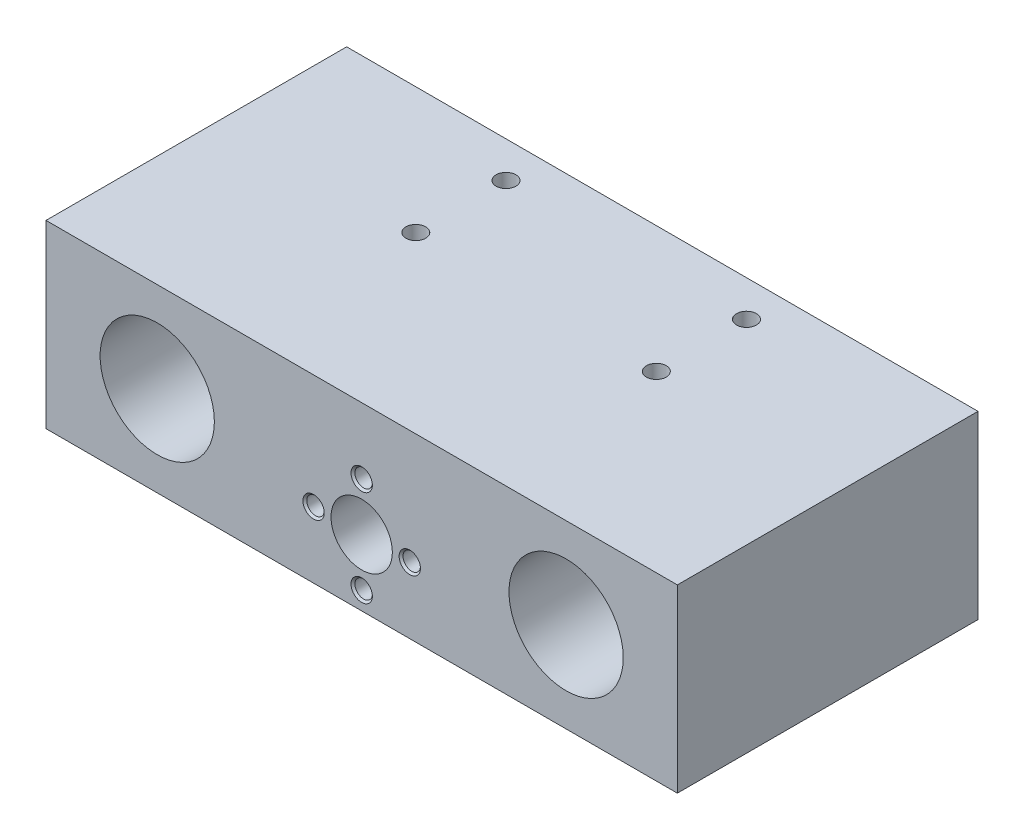
ISO-10303-21;
HEADER;
FILE_DESCRIPTION(('STEP AP214'),'2;1');
FILE_NAME('part.step','',(''),(''),'','','');
FILE_SCHEMA(('AUTOMOTIVE_DESIGN { 1 0 10303 214 1 1 1 1 }'));
ENDSEC;
DATA;
#1=APPLICATION_CONTEXT('core data for automotive mechanical design processes');
#2=APPLICATION_PROTOCOL_DEFINITION('international standard','automotive_design',2000,#1);
#3=PRODUCT_CONTEXT('',#1,'mechanical');
#4=PRODUCT('Part','Part','',(#3));
#5=PRODUCT_RELATED_PRODUCT_CATEGORY('part','',(#4));
#6=PRODUCT_DEFINITION_FORMATION('','',#4);
#7=PRODUCT_DEFINITION_CONTEXT('part definition',#1,'design');
#8=PRODUCT_DEFINITION('design','',#6,#7);
#9=PRODUCT_DEFINITION_SHAPE('','',#8);
#10=(LENGTH_UNIT() NAMED_UNIT(*) SI_UNIT(.MILLI.,.METRE.));
#11=(NAMED_UNIT(*) PLANE_ANGLE_UNIT() SI_UNIT($,.RADIAN.));
#12=(NAMED_UNIT(*) SI_UNIT($,.STERADIAN.) SOLID_ANGLE_UNIT());
#13=UNCERTAINTY_MEASURE_WITH_UNIT(LENGTH_MEASURE(1.E-05),#10,'distance_accuracy_value','');
#14=(GEOMETRIC_REPRESENTATION_CONTEXT(3) GLOBAL_UNCERTAINTY_ASSIGNED_CONTEXT((#13)) GLOBAL_UNIT_ASSIGNED_CONTEXT((#10,
#11,#12)) REPRESENTATION_CONTEXT('',''));
#15=CARTESIAN_POINT('',(0.,0.,0.));
#16=DIRECTION('',(0.,0.,1.));
#17=DIRECTION('',(1.,0.,0.));
#18=AXIS2_PLACEMENT_3D('',#15,#16,#17);
#19=CARTESIAN_POINT('',(0.,-4.,25.));
#20=DIRECTION('',(0.,0.,-1.));
#21=DIRECTION('',(-1.,0.,0.));
#22=AXIS2_PLACEMENT_3D('',#19,#20,#21);
#23=CYLINDRICAL_SURFACE('',#22,4.25);
#24=CARTESIAN_POINT('',(0.,-4.,-25.));
#25=DIRECTION('',(0.,0.,1.));
#26=DIRECTION('',(1.,0.,0.));
#27=AXIS2_PLACEMENT_3D('',#24,#25,#26);
#28=CIRCLE('',#27,4.25);
#29=CARTESIAN_POINT('',(4.25,-4.,-25.));
#30=VERTEX_POINT('',#29);
#31=EDGE_CURVE('E203',#30,#30,#28,.T.);
#32=ORIENTED_EDGE('',*,*,#31,.F.);
#33=EDGE_LOOP('',(#32));
#34=FACE_BOUND('',#33,.T.);
#35=CARTESIAN_POINT('',(0.,-4.,14.));
#36=DIRECTION('',(0.,0.,1.));
#37=DIRECTION('',(1.,0.,0.));
#38=AXIS2_PLACEMENT_3D('',#35,#36,#37);
#39=CIRCLE('',#38,4.25);
#40=CARTESIAN_POINT('',(4.25,-4.,14.));
#41=VERTEX_POINT('',#40);
#42=EDGE_CURVE('E59',#41,#41,#39,.T.);
#43=ORIENTED_EDGE('',*,*,#42,.T.);
#44=EDGE_LOOP('',(#43));
#45=FACE_BOUND('',#44,.T.);
#46=ADVANCED_FACE('F55',(#34,#45),#23,.F.);
#47=CARTESIAN_POINT('',(0.,0.,25.));
#48=DIRECTION('',(0.,0.,-1.));
#49=DIRECTION('',(-1.,0.,0.));
#50=AXIS2_PLACEMENT_3D('',#47,#48,#49);
#51=PLANE('',#50);
#52=CARTESIAN_POINT('',(-8.,-4.,25.));
#53=DIRECTION('',(0.,0.,1.));
#54=DIRECTION('',(1.,0.,0.));
#55=AXIS2_PLACEMENT_3D('',#52,#53,#54);
#56=CIRCLE('',#55,1.775);
#57=CARTESIAN_POINT('',(-6.225,-4.,25.));
#58=VERTEX_POINT('',#57);
#59=EDGE_CURVE('E146',#58,#58,#56,.T.);
#60=ORIENTED_EDGE('',*,*,#59,.F.);
#61=EDGE_LOOP('',(#60));
#62=FACE_BOUND('',#61,.T.);
#63=CARTESIAN_POINT('',(0.,4.,25.));
#64=DIRECTION('',(0.,0.,1.));
#65=DIRECTION('',(1.,0.,0.));
#66=AXIS2_PLACEMENT_3D('',#63,#64,#65);
#67=CIRCLE('',#66,1.775);
#68=CARTESIAN_POINT('',(1.77500000000003,4.,25.));
#69=VERTEX_POINT('',#68);
#70=EDGE_CURVE('E139',#69,#69,#67,.T.);
#71=ORIENTED_EDGE('',*,*,#70,.F.);
#72=EDGE_LOOP('',(#71));
#73=FACE_BOUND('',#72,.T.);
#74=CARTESIAN_POINT('',(8.,-4.00000000000005,25.));
#75=DIRECTION('',(0.,0.,1.));
#76=DIRECTION('',(1.,0.,0.));
#77=AXIS2_PLACEMENT_3D('',#74,#75,#76);
#78=CIRCLE('',#77,1.775);
#79=CARTESIAN_POINT('',(9.775,-4.00000000000005,25.));
#80=VERTEX_POINT('',#79);
#81=EDGE_CURVE('E155',#80,#80,#78,.T.);
#82=ORIENTED_EDGE('',*,*,#81,.F.);
#83=EDGE_LOOP('',(#82));
#84=FACE_BOUND('',#83,.T.);
#85=CARTESIAN_POINT('',(0.,-12.,25.));
#86=DIRECTION('',(0.,0.,1.));
#87=DIRECTION('',(1.,0.,0.));
#88=AXIS2_PLACEMENT_3D('',#85,#86,#87);
#89=CIRCLE('',#88,1.775);
#90=CARTESIAN_POINT('',(1.77499999999991,-12.,25.));
#91=VERTEX_POINT('',#90);
#92=EDGE_CURVE('E164',#91,#91,#89,.T.);
#93=ORIENTED_EDGE('',*,*,#92,.F.);
#94=EDGE_LOOP('',(#93));
#95=FACE_BOUND('',#94,.T.);
#96=CARTESIAN_POINT('',(0.,-4.,25.));
#97=DIRECTION('',(0.,0.,1.));
#98=DIRECTION('',(1.,0.,0.));
#99=AXIS2_PLACEMENT_3D('',#96,#97,#98);
#100=CIRCLE('',#99,5.1);
#101=CARTESIAN_POINT('',(5.1,-4.,25.));
#102=VERTEX_POINT('',#101);
#103=EDGE_CURVE('E173',#102,#102,#100,.T.);
#104=ORIENTED_EDGE('',*,*,#103,.F.);
#105=EDGE_LOOP('',(#104));
#106=FACE_BOUND('',#105,.T.);
#107=DIRECTION('',(0.,1.,0.));
#108=VECTOR('',#107,1.);
#109=CARTESIAN_POINT('',(52.5,-15.,25.));
#110=LINE('',#109,#108);
#111=CARTESIAN_POINT('',(52.5,-15.,25.));
#112=VERTEX_POINT('',#111);
#113=CARTESIAN_POINT('',(52.5,15.,25.));
#114=VERTEX_POINT('',#113);
#115=EDGE_CURVE('E219',#112,#114,#110,.T.);
#116=ORIENTED_EDGE('',*,*,#115,.T.);
#117=DIRECTION('',(-1.,0.,0.));
#118=VECTOR('',#117,1.);
#119=CARTESIAN_POINT('',(-52.5,15.,25.));
#120=LINE('',#119,#118);
#121=CARTESIAN_POINT('',(-52.5,15.,25.));
#122=VERTEX_POINT('',#121);
#123=EDGE_CURVE('E104',#114,#122,#120,.T.);
#124=ORIENTED_EDGE('',*,*,#123,.T.);
#125=DIRECTION('',(0.,-1.,0.));
#126=VECTOR('',#125,1.);
#127=CARTESIAN_POINT('',(-52.5,-15.,25.));
#128=LINE('',#127,#126);
#129=CARTESIAN_POINT('',(-52.5,-15.,25.));
#130=VERTEX_POINT('',#129);
#131=EDGE_CURVE('E222',#122,#130,#128,.T.);
#132=ORIENTED_EDGE('',*,*,#131,.T.);
#133=DIRECTION('',(1.,0.,0.));
#134=VECTOR('',#133,1.);
#135=CARTESIAN_POINT('',(-52.5,-15.,25.));
#136=LINE('',#135,#134);
#137=EDGE_CURVE('E73',#130,#112,#136,.T.);
#138=ORIENTED_EDGE('',*,*,#137,.T.);
#139=EDGE_LOOP('',(#116,#124,#132,#138));
#140=FACE_BOUND('',#139,.T.);
#141=CARTESIAN_POINT('',(-34.,0.,25.));
#142=DIRECTION('',(0.,0.,1.));
#143=DIRECTION('',(1.,0.,0.));
#144=AXIS2_PLACEMENT_3D('',#141,#142,#143);
#145=CIRCLE('',#144,9.5);
#146=CARTESIAN_POINT('',(-24.5,0.,25.));
#147=VERTEX_POINT('',#146);
#148=EDGE_CURVE('E213',#147,#147,#145,.T.);
#149=ORIENTED_EDGE('',*,*,#148,.F.);
#150=EDGE_LOOP('',(#149));
#151=FACE_BOUND('',#150,.T.);
#152=CARTESIAN_POINT('',(34.,0.,25.));
#153=DIRECTION('',(0.,0.,1.));
#154=DIRECTION('',(1.,0.,0.));
#155=AXIS2_PLACEMENT_3D('',#152,#153,#154);
#156=CIRCLE('',#155,9.5);
#157=CARTESIAN_POINT('',(43.5,0.,25.));
#158=VERTEX_POINT('',#157);
#159=EDGE_CURVE('E207',#158,#158,#156,.T.);
#160=ORIENTED_EDGE('',*,*,#159,.F.);
#161=EDGE_LOOP('',(#160));
#162=FACE_BOUND('',#161,.T.);
#163=ADVANCED_FACE('F259',(#62,#73,#84,#95,#106,#140,#151,#162),#51,.F.);
#164=CARTESIAN_POINT('',(0.,0.,-25.));
#165=DIRECTION('',(0.,0.,-1.));
#166=DIRECTION('',(-1.,0.,0.));
#167=AXIS2_PLACEMENT_3D('',#164,#165,#166);
#168=PLANE('',#167);
#169=CARTESIAN_POINT('',(34.,0.,-25.));
#170=DIRECTION('',(0.,0.,1.));
#171=DIRECTION('',(1.,0.,0.));
#172=AXIS2_PLACEMENT_3D('',#169,#170,#171);
#173=CIRCLE('',#172,9.5);
#174=CARTESIAN_POINT('',(43.5,0.,-25.));
#175=VERTEX_POINT('',#174);
#176=EDGE_CURVE('E206',#175,#175,#173,.T.);
#177=ORIENTED_EDGE('',*,*,#176,.T.);
#178=EDGE_LOOP('',(#177));
#179=FACE_BOUND('',#178,.T.);
#180=DIRECTION('',(0.,1.,0.));
#181=VECTOR('',#180,1.);
#182=CARTESIAN_POINT('',(52.5,-15.,-25.));
#183=LINE('',#182,#181);
#184=CARTESIAN_POINT('',(52.5,-15.,-25.));
#185=VERTEX_POINT('',#184);
#186=CARTESIAN_POINT('',(52.5,15.,-25.));
#187=VERTEX_POINT('',#186);
#188=EDGE_CURVE('E216',#185,#187,#183,.T.);
#189=ORIENTED_EDGE('',*,*,#188,.F.);
#190=DIRECTION('',(1.,0.,0.));
#191=VECTOR('',#190,1.);
#192=CARTESIAN_POINT('',(-52.5,-15.,-25.));
#193=LINE('',#192,#191);
#194=CARTESIAN_POINT('',(-52.5,-15.,-25.));
#195=VERTEX_POINT('',#194);
#196=EDGE_CURVE('E97',#195,#185,#193,.T.);
#197=ORIENTED_EDGE('',*,*,#196,.F.);
#198=DIRECTION('',(0.,-1.,0.));
#199=VECTOR('',#198,1.);
#200=CARTESIAN_POINT('',(-52.5,-15.,-25.));
#201=LINE('',#200,#199);
#202=CARTESIAN_POINT('',(-52.5,15.,-25.));
#203=VERTEX_POINT('',#202);
#204=EDGE_CURVE('E91',#203,#195,#201,.T.);
#205=ORIENTED_EDGE('',*,*,#204,.F.);
#206=DIRECTION('',(-1.,0.,0.));
#207=VECTOR('',#206,1.);
#208=CARTESIAN_POINT('',(-52.5,15.,-25.));
#209=LINE('',#208,#207);
#210=EDGE_CURVE('E228',#187,#203,#209,.T.);
#211=ORIENTED_EDGE('',*,*,#210,.F.);
#212=EDGE_LOOP('',(#189,#197,#205,#211));
#213=FACE_BOUND('',#212,.T.);
#214=CARTESIAN_POINT('',(-34.,0.,-25.));
#215=DIRECTION('',(0.,0.,1.));
#216=DIRECTION('',(1.,0.,0.));
#217=AXIS2_PLACEMENT_3D('',#214,#215,#216);
#218=CIRCLE('',#217,9.5);
#219=CARTESIAN_POINT('',(-24.5,0.,-25.));
#220=VERTEX_POINT('',#219);
#221=EDGE_CURVE('E210',#220,#220,#218,.T.);
#222=ORIENTED_EDGE('',*,*,#221,.T.);
#223=EDGE_LOOP('',(#222));
#224=FACE_BOUND('',#223,.T.);
#225=ORIENTED_EDGE('',*,*,#31,.T.);
#226=EDGE_LOOP('',(#225));
#227=FACE_BOUND('',#226,.T.);
#228=ADVANCED_FACE('F239',(#179,#213,#224,#227),#168,.T.);
#229=CARTESIAN_POINT('',(52.5,-15.,25.));
#230=DIRECTION('',(-1.,0.,0.));
#231=DIRECTION('',(0.,0.,1.));
#232=AXIS2_PLACEMENT_3D('',#229,#230,#231);
#233=PLANE('',#232);
#234=ORIENTED_EDGE('',*,*,#188,.T.);
#235=DIRECTION('',(0.,0.,-1.));
#236=VECTOR('',#235,1.);
#237=CARTESIAN_POINT('',(52.5,15.,25.));
#238=LINE('',#237,#236);
#239=EDGE_CURVE('E13',#114,#187,#238,.T.);
#240=ORIENTED_EDGE('',*,*,#239,.F.);
#241=ORIENTED_EDGE('',*,*,#115,.F.);
#242=DIRECTION('',(0.,0.,-1.));
#243=VECTOR('',#242,1.);
#244=CARTESIAN_POINT('',(52.5,-15.,25.));
#245=LINE('',#244,#243);
#246=EDGE_CURVE('E225',#112,#185,#245,.T.);
#247=ORIENTED_EDGE('',*,*,#246,.T.);
#248=EDGE_LOOP('',(#234,#240,#241,#247));
#249=FACE_BOUND('',#248,.T.);
#250=ADVANCED_FACE('F57',(#249),#233,.F.);
#251=CARTESIAN_POINT('',(-52.5,15.,25.));
#252=DIRECTION('',(0.,-1.,0.));
#253=DIRECTION('',(0.,0.,-1.));
#254=AXIS2_PLACEMENT_3D('',#251,#252,#253);
#255=PLANE('',#254);
#256=CARTESIAN_POINT('',(20.,15.,-19.));
#257=DIRECTION('',(0.,1.,0.));
#258=DIRECTION('',(0.,0.,1.));
#259=AXIS2_PLACEMENT_3D('',#256,#257,#258);
#260=CIRCLE('',#259,1.64999999999999);
#261=CARTESIAN_POINT('',(20.,15.,-17.35));
#262=VERTEX_POINT('',#261);
#263=EDGE_CURVE('E179',#262,#262,#260,.T.);
#264=ORIENTED_EDGE('',*,*,#263,.F.);
#265=EDGE_LOOP('',(#264));
#266=FACE_BOUND('',#265,.T.);
#267=CARTESIAN_POINT('',(20.,15.,-4.));
#268=DIRECTION('',(0.,1.,0.));
#269=DIRECTION('',(0.,0.,1.));
#270=AXIS2_PLACEMENT_3D('',#267,#268,#269);
#271=CIRCLE('',#270,1.64999999999999);
#272=CARTESIAN_POINT('',(20.,15.,-2.35000000000002));
#273=VERTEX_POINT('',#272);
#274=EDGE_CURVE('E185',#273,#273,#271,.T.);
#275=ORIENTED_EDGE('',*,*,#274,.F.);
#276=EDGE_LOOP('',(#275));
#277=FACE_BOUND('',#276,.T.);
#278=CARTESIAN_POINT('',(-20.,15.,-4.));
#279=DIRECTION('',(0.,1.,0.));
#280=DIRECTION('',(0.,0.,1.));
#281=AXIS2_PLACEMENT_3D('',#278,#279,#280);
#282=CIRCLE('',#281,1.64999999999999);
#283=CARTESIAN_POINT('',(-20.,15.,-2.35000000000002));
#284=VERTEX_POINT('',#283);
#285=EDGE_CURVE('E191',#284,#284,#282,.T.);
#286=ORIENTED_EDGE('',*,*,#285,.F.);
#287=EDGE_LOOP('',(#286));
#288=FACE_BOUND('',#287,.T.);
#289=CARTESIAN_POINT('',(-20.,15.,-19.));
#290=DIRECTION('',(0.,1.,0.));
#291=DIRECTION('',(0.,0.,1.));
#292=AXIS2_PLACEMENT_3D('',#289,#290,#291);
#293=CIRCLE('',#292,1.64999999999999);
#294=CARTESIAN_POINT('',(-20.,15.,-17.35));
#295=VERTEX_POINT('',#294);
#296=EDGE_CURVE('E197',#295,#295,#293,.T.);
#297=ORIENTED_EDGE('',*,*,#296,.F.);
#298=EDGE_LOOP('',(#297));
#299=FACE_BOUND('',#298,.T.);
#300=ORIENTED_EDGE('',*,*,#210,.T.);
#301=DIRECTION('',(0.,0.,-1.));
#302=VECTOR('',#301,1.);
#303=CARTESIAN_POINT('',(-52.5,15.,25.));
#304=LINE('',#303,#302);
#305=EDGE_CURVE('E65',#122,#203,#304,.T.);
#306=ORIENTED_EDGE('',*,*,#305,.F.);
#307=ORIENTED_EDGE('',*,*,#123,.F.);
#308=ORIENTED_EDGE('',*,*,#239,.T.);
#309=EDGE_LOOP('',(#300,#306,#307,#308));
#310=FACE_BOUND('',#309,.T.);
#311=ADVANCED_FACE('F255',(#266,#277,#288,#299,#310),#255,.F.);
#312=CARTESIAN_POINT('',(-52.5,-15.,25.));
#313=DIRECTION('',(1.,0.,0.));
#314=DIRECTION('',(0.,0.,-1.));
#315=AXIS2_PLACEMENT_3D('',#312,#313,#314);
#316=PLANE('',#315);
#317=ORIENTED_EDGE('',*,*,#204,.T.);
#318=DIRECTION('',(0.,0.,-1.));
#319=VECTOR('',#318,1.);
#320=CARTESIAN_POINT('',(-52.5,-15.,25.));
#321=LINE('',#320,#319);
#322=EDGE_CURVE('E233',#130,#195,#321,.T.);
#323=ORIENTED_EDGE('',*,*,#322,.F.);
#324=ORIENTED_EDGE('',*,*,#131,.F.);
#325=ORIENTED_EDGE('',*,*,#305,.T.);
#326=EDGE_LOOP('',(#317,#323,#324,#325));
#327=FACE_BOUND('',#326,.T.);
#328=ADVANCED_FACE('F236',(#327),#316,.F.);
#329=CARTESIAN_POINT('',(-52.5,-15.,25.));
#330=DIRECTION('',(0.,1.,0.));
#331=DIRECTION('',(0.,0.,1.));
#332=AXIS2_PLACEMENT_3D('',#329,#330,#331);
#333=PLANE('',#332);
#334=ORIENTED_EDGE('',*,*,#196,.T.);
#335=ORIENTED_EDGE('',*,*,#246,.F.);
#336=ORIENTED_EDGE('',*,*,#137,.F.);
#337=ORIENTED_EDGE('',*,*,#322,.T.);
#338=EDGE_LOOP('',(#334,#335,#336,#337));
#339=FACE_BOUND('',#338,.T.);
#340=ADVANCED_FACE('F244',(#339),#333,.F.);
#341=CARTESIAN_POINT('',(-34.,0.,25.));
#342=DIRECTION('',(0.,0.,-1.));
#343=DIRECTION('',(-1.,0.,0.));
#344=AXIS2_PLACEMENT_3D('',#341,#342,#343);
#345=CYLINDRICAL_SURFACE('',#344,9.5);
#346=ORIENTED_EDGE('',*,*,#148,.T.);
#347=EDGE_LOOP('',(#346));
#348=FACE_BOUND('',#347,.T.);
#349=ORIENTED_EDGE('',*,*,#221,.F.);
#350=EDGE_LOOP('',(#349));
#351=FACE_BOUND('',#350,.T.);
#352=ADVANCED_FACE('F246',(#348,#351),#345,.F.);
#353=CARTESIAN_POINT('',(34.,0.,25.));
#354=DIRECTION('',(0.,0.,-1.));
#355=DIRECTION('',(-1.,0.,0.));
#356=AXIS2_PLACEMENT_3D('',#353,#354,#355);
#357=CYLINDRICAL_SURFACE('',#356,9.5);
#358=ORIENTED_EDGE('',*,*,#159,.T.);
#359=EDGE_LOOP('',(#358));
#360=FACE_BOUND('',#359,.T.);
#361=ORIENTED_EDGE('',*,*,#176,.F.);
#362=EDGE_LOOP('',(#361));
#363=FACE_BOUND('',#362,.T.);
#364=ADVANCED_FACE('F252',(#360,#363),#357,.F.);
#365=CARTESIAN_POINT('',(-20.,3.5,-19.));
#366=DIRECTION('',(0.,1.,0.));
#367=DIRECTION('',(0.,0.,1.));
#368=AXIS2_PLACEMENT_3D('',#365,#366,#367);
#369=CONICAL_SURFACE('',#368,1.65,1.02974425867665);
#370=CARTESIAN_POINT('',(-20.,2.50857997860453,-19.));
#371=VERTEX_POINT('',#370);
#372=VERTEX_LOOP('',#371);
#373=FACE_BOUND('',#372,.T.);
#374=CARTESIAN_POINT('',(-20.,3.5,-19.));
#375=DIRECTION('',(0.,1.,0.));
#376=DIRECTION('',(0.,0.,1.));
#377=AXIS2_PLACEMENT_3D('',#374,#375,#376);
#378=CIRCLE('',#377,1.65);
#379=CARTESIAN_POINT('',(-20.,3.5,-17.35));
#380=VERTEX_POINT('',#379);
#381=EDGE_CURVE('E200',#380,#380,#378,.T.);
#382=ORIENTED_EDGE('',*,*,#381,.T.);
#383=EDGE_LOOP('',(#382));
#384=FACE_BOUND('',#383,.T.);
#385=ADVANCED_FACE('F271',(#373,#384),#369,.F.);
#386=CARTESIAN_POINT('',(-20.,15.,-19.));
#387=DIRECTION('',(0.,1.,0.));
#388=DIRECTION('',(0.,0.,1.));
#389=AXIS2_PLACEMENT_3D('',#386,#387,#388);
#390=CYLINDRICAL_SURFACE('',#389,1.64999999999999);
#391=ORIENTED_EDGE('',*,*,#381,.F.);
#392=EDGE_LOOP('',(#391));
#393=FACE_BOUND('',#392,.T.);
#394=ORIENTED_EDGE('',*,*,#296,.T.);
#395=EDGE_LOOP('',(#394));
#396=FACE_BOUND('',#395,.T.);
#397=ADVANCED_FACE('F296',(#393,#396),#390,.F.);
#398=CARTESIAN_POINT('',(-20.,3.5,-4.));
#399=DIRECTION('',(0.,1.,0.));
#400=DIRECTION('',(0.,0.,1.));
#401=AXIS2_PLACEMENT_3D('',#398,#399,#400);
#402=CONICAL_SURFACE('',#401,1.65,1.02974425867665);
#403=CARTESIAN_POINT('',(-20.,2.50857997860453,-4.));
#404=VERTEX_POINT('',#403);
#405=VERTEX_LOOP('',#404);
#406=FACE_BOUND('',#405,.T.);
#407=CARTESIAN_POINT('',(-20.,3.5,-4.));
#408=DIRECTION('',(0.,1.,0.));
#409=DIRECTION('',(0.,0.,1.));
#410=AXIS2_PLACEMENT_3D('',#407,#408,#409);
#411=CIRCLE('',#410,1.65);
#412=CARTESIAN_POINT('',(-20.,3.5,-2.35));
#413=VERTEX_POINT('',#412);
#414=EDGE_CURVE('E194',#413,#413,#411,.T.);
#415=ORIENTED_EDGE('',*,*,#414,.T.);
#416=EDGE_LOOP('',(#415));
#417=FACE_BOUND('',#416,.T.);
#418=ADVANCED_FACE('F298',(#406,#417),#402,.F.);
#419=CARTESIAN_POINT('',(-20.,15.,-4.));
#420=DIRECTION('',(0.,1.,0.));
#421=DIRECTION('',(0.,0.,1.));
#422=AXIS2_PLACEMENT_3D('',#419,#420,#421);
#423=CYLINDRICAL_SURFACE('',#422,1.64999999999999);
#424=ORIENTED_EDGE('',*,*,#414,.F.);
#425=EDGE_LOOP('',(#424));
#426=FACE_BOUND('',#425,.T.);
#427=ORIENTED_EDGE('',*,*,#285,.T.);
#428=EDGE_LOOP('',(#427));
#429=FACE_BOUND('',#428,.T.);
#430=ADVANCED_FACE('F304',(#426,#429),#423,.F.);
#431=CARTESIAN_POINT('',(20.,3.5,-4.));
#432=DIRECTION('',(0.,1.,0.));
#433=DIRECTION('',(0.,0.,1.));
#434=AXIS2_PLACEMENT_3D('',#431,#432,#433);
#435=CONICAL_SURFACE('',#434,1.65,1.02974425867665);
#436=CARTESIAN_POINT('',(20.,2.50857997860453,-4.));
#437=VERTEX_POINT('',#436);
#438=VERTEX_LOOP('',#437);
#439=FACE_BOUND('',#438,.T.);
#440=CARTESIAN_POINT('',(20.,3.5,-4.));
#441=DIRECTION('',(0.,1.,0.));
#442=DIRECTION('',(0.,0.,1.));
#443=AXIS2_PLACEMENT_3D('',#440,#441,#442);
#444=CIRCLE('',#443,1.65);
#445=CARTESIAN_POINT('',(20.,3.5,-2.35));
#446=VERTEX_POINT('',#445);
#447=EDGE_CURVE('E188',#446,#446,#444,.T.);
#448=ORIENTED_EDGE('',*,*,#447,.T.);
#449=EDGE_LOOP('',(#448));
#450=FACE_BOUND('',#449,.T.);
#451=ADVANCED_FACE('F312',(#439,#450),#435,.F.);
#452=CARTESIAN_POINT('',(20.,15.,-4.));
#453=DIRECTION('',(0.,1.,0.));
#454=DIRECTION('',(0.,0.,1.));
#455=AXIS2_PLACEMENT_3D('',#452,#453,#454);
#456=CYLINDRICAL_SURFACE('',#455,1.64999999999999);
#457=ORIENTED_EDGE('',*,*,#447,.F.);
#458=EDGE_LOOP('',(#457));
#459=FACE_BOUND('',#458,.T.);
#460=ORIENTED_EDGE('',*,*,#274,.T.);
#461=EDGE_LOOP('',(#460));
#462=FACE_BOUND('',#461,.T.);
#463=ADVANCED_FACE('F316',(#459,#462),#456,.F.);
#464=CARTESIAN_POINT('',(20.,3.5,-19.));
#465=DIRECTION('',(0.,1.,0.));
#466=DIRECTION('',(0.,0.,1.));
#467=AXIS2_PLACEMENT_3D('',#464,#465,#466);
#468=CONICAL_SURFACE('',#467,1.65,1.02974425867665);
#469=CARTESIAN_POINT('',(20.,2.50857997860453,-19.));
#470=VERTEX_POINT('',#469);
#471=VERTEX_LOOP('',#470);
#472=FACE_BOUND('',#471,.T.);
#473=CARTESIAN_POINT('',(20.,3.5,-19.));
#474=DIRECTION('',(0.,1.,0.));
#475=DIRECTION('',(0.,0.,1.));
#476=AXIS2_PLACEMENT_3D('',#473,#474,#475);
#477=CIRCLE('',#476,1.65);
#478=CARTESIAN_POINT('',(20.,3.5,-17.35));
#479=VERTEX_POINT('',#478);
#480=EDGE_CURVE('E182',#479,#479,#477,.T.);
#481=ORIENTED_EDGE('',*,*,#480,.T.);
#482=EDGE_LOOP('',(#481));
#483=FACE_BOUND('',#482,.T.);
#484=ADVANCED_FACE('F320',(#472,#483),#468,.F.);
#485=CARTESIAN_POINT('',(20.,15.,-19.));
#486=DIRECTION('',(0.,1.,0.));
#487=DIRECTION('',(0.,0.,1.));
#488=AXIS2_PLACEMENT_3D('',#485,#486,#487);
#489=CYLINDRICAL_SURFACE('',#488,1.64999999999999);
#490=ORIENTED_EDGE('',*,*,#480,.F.);
#491=EDGE_LOOP('',(#490));
#492=FACE_BOUND('',#491,.T.);
#493=ORIENTED_EDGE('',*,*,#263,.T.);
#494=EDGE_LOOP('',(#493));
#495=FACE_BOUND('',#494,.T.);
#496=ADVANCED_FACE('F324',(#492,#495),#489,.F.);
#497=CARTESIAN_POINT('',(0.,-4.,14.));
#498=DIRECTION('',(0.,0.,1.));
#499=DIRECTION('',(1.,0.,0.));
#500=AXIS2_PLACEMENT_3D('',#497,#498,#499);
#501=CYLINDRICAL_SURFACE('',#500,5.1);
#502=CARTESIAN_POINT('',(0.,-4.,14.));
#503=DIRECTION('',(0.,0.,1.));
#504=DIRECTION('',(1.,0.,0.));
#505=AXIS2_PLACEMENT_3D('',#502,#503,#504);
#506=CIRCLE('',#505,5.1);
#507=CARTESIAN_POINT('',(5.1,-4.,14.));
#508=VERTEX_POINT('',#507);
#509=EDGE_CURVE('E174',#508,#508,#506,.T.);
#510=ORIENTED_EDGE('',*,*,#509,.F.);
#511=EDGE_LOOP('',(#510));
#512=FACE_BOUND('',#511,.T.);
#513=ORIENTED_EDGE('',*,*,#103,.T.);
#514=EDGE_LOOP('',(#513));
#515=FACE_BOUND('',#514,.T.);
#516=ADVANCED_FACE('F328',(#512,#515),#501,.F.);
#517=CARTESIAN_POINT('',(0.,-4.,14.));
#518=DIRECTION('',(0.,0.,1.));
#519=DIRECTION('',(1.,0.,0.));
#520=AXIS2_PLACEMENT_3D('',#517,#518,#519);
#521=PLANE('',#520);
#522=ORIENTED_EDGE('',*,*,#42,.F.);
#523=EDGE_LOOP('',(#522));
#524=FACE_BOUND('',#523,.T.);
#525=ORIENTED_EDGE('',*,*,#509,.T.);
#526=EDGE_LOOP('',(#525));
#527=FACE_BOUND('',#526,.T.);
#528=ADVANCED_FACE('F332',(#524,#527),#521,.T.);
#529=CARTESIAN_POINT('',(0.,-12.,10.));
#530=DIRECTION('',(0.,0.,1.));
#531=DIRECTION('',(1.,0.,0.));
#532=AXIS2_PLACEMENT_3D('',#529,#530,#531);
#533=CONICAL_SURFACE('',#532,1.44999999999999,1.02974425867665);
#534=CARTESIAN_POINT('',(0.,-12.,9.12875210241004));
#535=VERTEX_POINT('',#534);
#536=VERTEX_LOOP('',#535);
#537=FACE_BOUND('',#536,.T.);
#538=CARTESIAN_POINT('',(0.,-12.,10.));
#539=DIRECTION('',(0.,0.,1.));
#540=DIRECTION('',(1.,0.,0.));
#541=AXIS2_PLACEMENT_3D('',#538,#539,#540);
#542=CIRCLE('',#541,1.44999999999999);
#543=CARTESIAN_POINT('',(1.4499999999999,-12.,10.));
#544=VERTEX_POINT('',#543);
#545=EDGE_CURVE('E170',#544,#544,#542,.T.);
#546=ORIENTED_EDGE('',*,*,#545,.T.);
#547=EDGE_LOOP('',(#546));
#548=FACE_BOUND('',#547,.T.);
#549=ADVANCED_FACE('F336',(#537,#548),#533,.F.);
#550=CARTESIAN_POINT('',(0.,-12.,25.));
#551=DIRECTION('',(0.,0.,1.));
#552=DIRECTION('',(1.,0.,0.));
#553=AXIS2_PLACEMENT_3D('',#550,#551,#552);
#554=CYLINDRICAL_SURFACE('',#553,1.44999999999999);
#555=ORIENTED_EDGE('',*,*,#545,.F.);
#556=EDGE_LOOP('',(#555));
#557=FACE_BOUND('',#556,.T.);
#558=CARTESIAN_POINT('',(0.,-12.,24.675));
#559=DIRECTION('',(0.,0.,1.));
#560=DIRECTION('',(1.,0.,0.));
#561=AXIS2_PLACEMENT_3D('',#558,#559,#560);
#562=CIRCLE('',#561,1.44999999999999);
#563=CARTESIAN_POINT('',(1.4499999999999,-12.,24.675));
#564=VERTEX_POINT('',#563);
#565=EDGE_CURVE('E167',#564,#564,#562,.T.);
#566=ORIENTED_EDGE('',*,*,#565,.T.);
#567=EDGE_LOOP('',(#566));
#568=FACE_BOUND('',#567,.T.);
#569=ADVANCED_FACE('F340',(#557,#568),#554,.F.);
#570=CARTESIAN_POINT('',(0.,-12.,25.));
#571=DIRECTION('',(0.,0.,1.));
#572=DIRECTION('',(1.,0.,0.));
#573=AXIS2_PLACEMENT_3D('',#570,#571,#572);
#574=CONICAL_SURFACE('',#573,1.775,0.785398163397451);
#575=ORIENTED_EDGE('',*,*,#565,.F.);
#576=EDGE_LOOP('',(#575));
#577=FACE_BOUND('',#576,.T.);
#578=ORIENTED_EDGE('',*,*,#92,.T.);
#579=EDGE_LOOP('',(#578));
#580=FACE_BOUND('',#579,.T.);
#581=ADVANCED_FACE('F344',(#577,#580),#574,.F.);
#582=CARTESIAN_POINT('',(8.,-4.00000000000005,10.));
#583=DIRECTION('',(0.,0.,1.));
#584=DIRECTION('',(1.,0.,0.));
#585=AXIS2_PLACEMENT_3D('',#582,#583,#584);
#586=CONICAL_SURFACE('',#585,1.44999999999999,1.02974425867665);
#587=CARTESIAN_POINT('',(8.,-4.00000000000005,9.12875210241004));
#588=VERTEX_POINT('',#587);
#589=VERTEX_LOOP('',#588);
#590=FACE_BOUND('',#589,.T.);
#591=CARTESIAN_POINT('',(8.,-4.00000000000005,10.));
#592=DIRECTION('',(0.,0.,1.));
#593=DIRECTION('',(1.,0.,0.));
#594=AXIS2_PLACEMENT_3D('',#591,#592,#593);
#595=CIRCLE('',#594,1.44999999999999);
#596=CARTESIAN_POINT('',(9.44999999999999,-4.00000000000005,10.));
#597=VERTEX_POINT('',#596);
#598=EDGE_CURVE('E161',#597,#597,#595,.T.);
#599=ORIENTED_EDGE('',*,*,#598,.T.);
#600=EDGE_LOOP('',(#599));
#601=FACE_BOUND('',#600,.T.);
#602=ADVANCED_FACE('F348',(#590,#601),#586,.F.);
#603=CARTESIAN_POINT('',(8.,-4.00000000000005,25.));
#604=DIRECTION('',(0.,0.,1.));
#605=DIRECTION('',(1.,0.,0.));
#606=AXIS2_PLACEMENT_3D('',#603,#604,#605);
#607=CYLINDRICAL_SURFACE('',#606,1.44999999999999);
#608=ORIENTED_EDGE('',*,*,#598,.F.);
#609=EDGE_LOOP('',(#608));
#610=FACE_BOUND('',#609,.T.);
#611=CARTESIAN_POINT('',(8.,-4.00000000000005,24.675));
#612=DIRECTION('',(0.,0.,1.));
#613=DIRECTION('',(1.,0.,0.));
#614=AXIS2_PLACEMENT_3D('',#611,#612,#613);
#615=CIRCLE('',#614,1.44999999999999);
#616=CARTESIAN_POINT('',(9.44999999999999,-4.00000000000005,24.675));
#617=VERTEX_POINT('',#616);
#618=EDGE_CURVE('E158',#617,#617,#615,.T.);
#619=ORIENTED_EDGE('',*,*,#618,.T.);
#620=EDGE_LOOP('',(#619));
#621=FACE_BOUND('',#620,.T.);
#622=ADVANCED_FACE('F352',(#610,#621),#607,.F.);
#623=CARTESIAN_POINT('',(8.,-4.00000000000005,25.));
#624=DIRECTION('',(0.,0.,1.));
#625=DIRECTION('',(1.,0.,0.));
#626=AXIS2_PLACEMENT_3D('',#623,#624,#625);
#627=CONICAL_SURFACE('',#626,1.775,0.785398163397451);
#628=ORIENTED_EDGE('',*,*,#618,.F.);
#629=EDGE_LOOP('',(#628));
#630=FACE_BOUND('',#629,.T.);
#631=ORIENTED_EDGE('',*,*,#81,.T.);
#632=EDGE_LOOP('',(#631));
#633=FACE_BOUND('',#632,.T.);
#634=ADVANCED_FACE('F356',(#630,#633),#627,.F.);
#635=CARTESIAN_POINT('',(0.,4.,10.));
#636=DIRECTION('',(0.,0.,1.));
#637=DIRECTION('',(1.,0.,0.));
#638=AXIS2_PLACEMENT_3D('',#635,#636,#637);
#639=CONICAL_SURFACE('',#638,1.44999999999999,1.02974425867665);
#640=CARTESIAN_POINT('',(0.,4.,9.12875210241004));
#641=VERTEX_POINT('',#640);
#642=VERTEX_LOOP('',#641);
#643=FACE_BOUND('',#642,.T.);
#644=CARTESIAN_POINT('',(0.,4.,10.));
#645=DIRECTION('',(0.,0.,1.));
#646=DIRECTION('',(1.,0.,0.));
#647=AXIS2_PLACEMENT_3D('',#644,#645,#646);
#648=CIRCLE('',#647,1.44999999999999);
#649=CARTESIAN_POINT('',(1.45000000000002,4.,10.));
#650=VERTEX_POINT('',#649);
#651=EDGE_CURVE('E152',#650,#650,#648,.T.);
#652=ORIENTED_EDGE('',*,*,#651,.T.);
#653=EDGE_LOOP('',(#652));
#654=FACE_BOUND('',#653,.T.);
#655=ADVANCED_FACE('F360',(#643,#654),#639,.F.);
#656=CARTESIAN_POINT('',(0.,4.,25.));
#657=DIRECTION('',(0.,0.,1.));
#658=DIRECTION('',(1.,0.,0.));
#659=AXIS2_PLACEMENT_3D('',#656,#657,#658);
#660=CYLINDRICAL_SURFACE('',#659,1.44999999999999);
#661=ORIENTED_EDGE('',*,*,#651,.F.);
#662=EDGE_LOOP('',(#661));
#663=FACE_BOUND('',#662,.T.);
#664=CARTESIAN_POINT('',(0.,4.,24.675));
#665=DIRECTION('',(0.,0.,1.));
#666=DIRECTION('',(1.,0.,0.));
#667=AXIS2_PLACEMENT_3D('',#664,#665,#666);
#668=CIRCLE('',#667,1.44999999999999);
#669=CARTESIAN_POINT('',(1.45000000000002,4.,24.675));
#670=VERTEX_POINT('',#669);
#671=EDGE_CURVE('E143',#670,#670,#668,.T.);
#672=ORIENTED_EDGE('',*,*,#671,.T.);
#673=EDGE_LOOP('',(#672));
#674=FACE_BOUND('',#673,.T.);
#675=ADVANCED_FACE('F364',(#663,#674),#660,.F.);
#676=CARTESIAN_POINT('',(0.,4.,25.));
#677=DIRECTION('',(0.,0.,1.));
#678=DIRECTION('',(1.,0.,0.));
#679=AXIS2_PLACEMENT_3D('',#676,#677,#678);
#680=CONICAL_SURFACE('',#679,1.775,0.785398163397451);
#681=ORIENTED_EDGE('',*,*,#671,.F.);
#682=EDGE_LOOP('',(#681));
#683=FACE_BOUND('',#682,.T.);
#684=ORIENTED_EDGE('',*,*,#70,.T.);
#685=EDGE_LOOP('',(#684));
#686=FACE_BOUND('',#685,.T.);
#687=ADVANCED_FACE('F133',(#683,#686),#680,.F.);
#688=CARTESIAN_POINT('',(-8.,-4.,10.));
#689=DIRECTION('',(0.,0.,1.));
#690=DIRECTION('',(1.,0.,0.));
#691=AXIS2_PLACEMENT_3D('',#688,#689,#690);
#692=CONICAL_SURFACE('',#691,1.44999999999999,1.02974425867665);
#693=CARTESIAN_POINT('',(-8.,-4.,9.12875210241004));
#694=VERTEX_POINT('',#693);
#695=VERTEX_LOOP('',#694);
#696=FACE_BOUND('',#695,.T.);
#697=CARTESIAN_POINT('',(-8.,-4.,10.));
#698=DIRECTION('',(0.,0.,1.));
#699=DIRECTION('',(1.,0.,0.));
#700=AXIS2_PLACEMENT_3D('',#697,#698,#699);
#701=CIRCLE('',#700,1.44999999999999);
#702=CARTESIAN_POINT('',(-6.55000000000001,-4.,10.));
#703=VERTEX_POINT('',#702);
#704=EDGE_CURVE('E137',#703,#703,#701,.T.);
#705=ORIENTED_EDGE('',*,*,#704,.T.);
#706=EDGE_LOOP('',(#705));
#707=FACE_BOUND('',#706,.T.);
#708=ADVANCED_FACE('F129',(#696,#707),#692,.F.);
#709=CARTESIAN_POINT('',(-8.,-4.,25.));
#710=DIRECTION('',(0.,0.,1.));
#711=DIRECTION('',(1.,0.,0.));
#712=AXIS2_PLACEMENT_3D('',#709,#710,#711);
#713=CYLINDRICAL_SURFACE('',#712,1.44999999999999);
#714=ORIENTED_EDGE('',*,*,#704,.F.);
#715=EDGE_LOOP('',(#714));
#716=FACE_BOUND('',#715,.T.);
#717=CARTESIAN_POINT('',(-8.,-4.,24.675));
#718=DIRECTION('',(0.,0.,1.));
#719=DIRECTION('',(1.,0.,0.));
#720=AXIS2_PLACEMENT_3D('',#717,#718,#719);
#721=CIRCLE('',#720,1.44999999999999);
#722=CARTESIAN_POINT('',(-6.55000000000001,-4.,24.675));
#723=VERTEX_POINT('',#722);
#724=EDGE_CURVE('E140',#723,#723,#721,.T.);
#725=ORIENTED_EDGE('',*,*,#724,.T.);
#726=EDGE_LOOP('',(#725));
#727=FACE_BOUND('',#726,.T.);
#728=ADVANCED_FACE('F132',(#716,#727),#713,.F.);
#729=CARTESIAN_POINT('',(-8.,-4.,25.));
#730=DIRECTION('',(0.,0.,1.));
#731=DIRECTION('',(1.,0.,0.));
#732=AXIS2_PLACEMENT_3D('',#729,#730,#731);
#733=CONICAL_SURFACE('',#732,1.775,0.785398163397451);
#734=ORIENTED_EDGE('',*,*,#724,.F.);
#735=EDGE_LOOP('',(#734));
#736=FACE_BOUND('',#735,.T.);
#737=ORIENTED_EDGE('',*,*,#59,.T.);
#738=EDGE_LOOP('',(#737));
#739=FACE_BOUND('',#738,.T.);
#740=ADVANCED_FACE('F374',(#736,#739),#733,.F.);
#741=CLOSED_SHELL('',(#46,#163,#228,#250,#311,#328,#340,#352,#364,#385,#397,#418,#430,#451,#463,
#484,#496,#516,#528,#549,#569,#581,#602,#622,#634,#655,#675,#687,#708,#728,#740));
#742=MANIFOLD_SOLID_BREP('B2',#741);
#743=ADVANCED_BREP_SHAPE_REPRESENTATION('',(#18,#742),#14);
#744=SHAPE_DEFINITION_REPRESENTATION(#9,#743);
ENDSEC;
END-ISO-10303-21;
